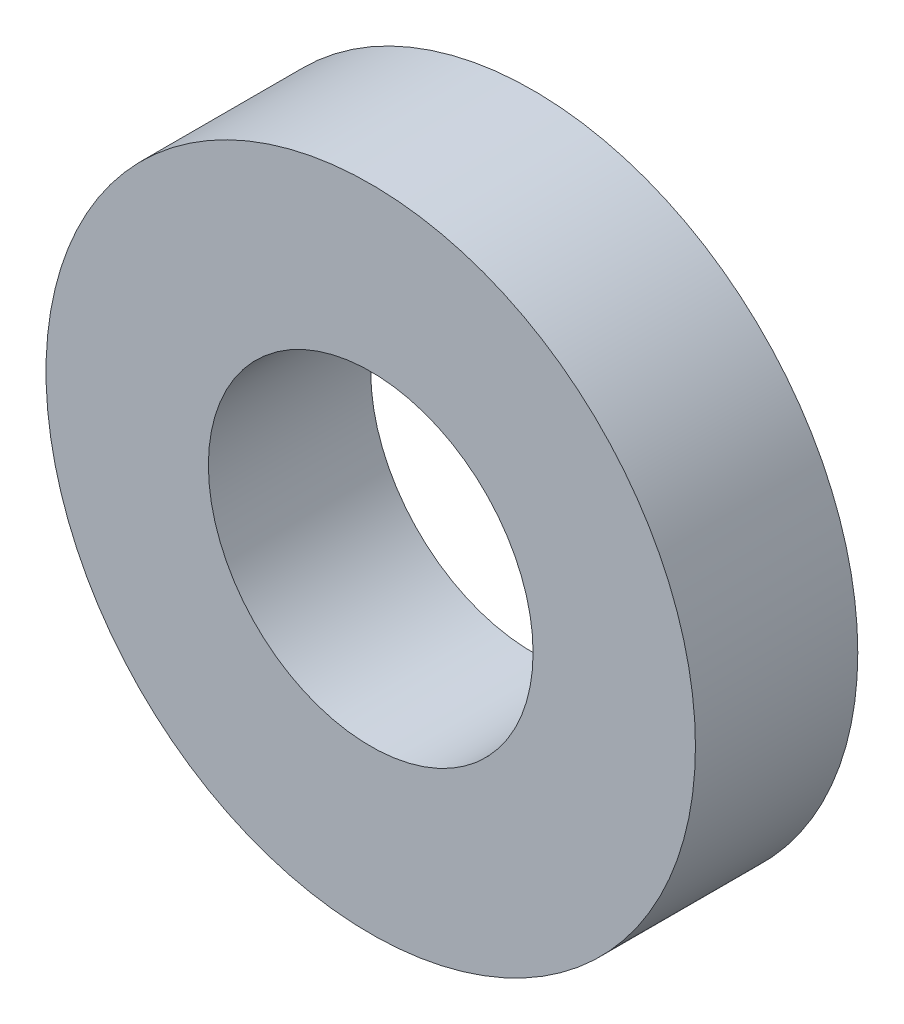
ISO-10303-21;
HEADER;
FILE_DESCRIPTION(('STEP AP214'),'2;1');
FILE_NAME('part.step','',(''),(''),'','','');
FILE_SCHEMA(('AUTOMOTIVE_DESIGN { 1 0 10303 214 1 1 1 1 }'));
ENDSEC;
DATA;
#1=APPLICATION_CONTEXT('core data for automotive mechanical design processes');
#2=APPLICATION_PROTOCOL_DEFINITION('international standard','automotive_design',2000,#1);
#3=PRODUCT_CONTEXT('',#1,'mechanical');
#4=PRODUCT('Part','Part','',(#3));
#5=PRODUCT_RELATED_PRODUCT_CATEGORY('part','',(#4));
#6=PRODUCT_DEFINITION_FORMATION('','',#4);
#7=PRODUCT_DEFINITION_CONTEXT('part definition',#1,'design');
#8=PRODUCT_DEFINITION('design','',#6,#7);
#9=PRODUCT_DEFINITION_SHAPE('','',#8);
#10=(LENGTH_UNIT() NAMED_UNIT(*) SI_UNIT(.MILLI.,.METRE.));
#11=(NAMED_UNIT(*) PLANE_ANGLE_UNIT() SI_UNIT($,.RADIAN.));
#12=(NAMED_UNIT(*) SI_UNIT($,.STERADIAN.) SOLID_ANGLE_UNIT());
#13=UNCERTAINTY_MEASURE_WITH_UNIT(LENGTH_MEASURE(1.E-05),#10,'distance_accuracy_value','');
#14=(GEOMETRIC_REPRESENTATION_CONTEXT(3) GLOBAL_UNCERTAINTY_ASSIGNED_CONTEXT((#13)) GLOBAL_UNIT_ASSIGNED_CONTEXT((#10,
#11,#12)) REPRESENTATION_CONTEXT('',''));
#15=CARTESIAN_POINT('',(0.,0.,0.));
#16=DIRECTION('',(0.,0.,1.));
#17=DIRECTION('',(1.,0.,0.));
#18=AXIS2_PLACEMENT_3D('',#15,#16,#17);
#19=CARTESIAN_POINT('',(8.,8.,4.));
#20=DIRECTION('',(0.,0.,1.));
#21=DIRECTION('',(1.,0.,0.));
#22=AXIS2_PLACEMENT_3D('',#19,#20,#21);
#23=PLANE('',#22);
#24=CARTESIAN_POINT('',(8.,8.,4.));
#25=DIRECTION('',(0.,0.,1.));
#26=DIRECTION('',(1.,0.,0.));
#27=AXIS2_PLACEMENT_3D('',#24,#25,#26);
#28=CIRCLE('',#27,8.);
#29=CARTESIAN_POINT('',(16.,8.,4.));
#30=VERTEX_POINT('',#29);
#31=EDGE_CURVE('E10',#30,#30,#28,.T.);
#32=ORIENTED_EDGE('',*,*,#31,.T.);
#33=EDGE_LOOP('',(#32));
#34=FACE_BOUND('',#33,.T.);
#35=CARTESIAN_POINT('',(8.,8.,4.));
#36=DIRECTION('',(0.,0.,1.));
#37=DIRECTION('',(1.,0.,0.));
#38=AXIS2_PLACEMENT_3D('',#35,#36,#37);
#39=CIRCLE('',#38,4.);
#40=CARTESIAN_POINT('',(12.,8.,4.));
#41=VERTEX_POINT('',#40);
#42=EDGE_CURVE('E55',#41,#41,#39,.T.);
#43=ORIENTED_EDGE('',*,*,#42,.F.);
#44=EDGE_LOOP('',(#43));
#45=FACE_BOUND('',#44,.T.);
#46=ADVANCED_FACE('F41',(#34,#45),#23,.T.);
#47=CARTESIAN_POINT('',(8.,8.,0.));
#48=DIRECTION('',(0.,0.,1.));
#49=DIRECTION('',(1.,0.,0.));
#50=AXIS2_PLACEMENT_3D('',#47,#48,#49);
#51=PLANE('',#50);
#52=CARTESIAN_POINT('',(8.,8.,0.));
#53=DIRECTION('',(0.,0.,1.));
#54=DIRECTION('',(1.,0.,0.));
#55=AXIS2_PLACEMENT_3D('',#52,#53,#54);
#56=CIRCLE('',#55,8.);
#57=CARTESIAN_POINT('',(16.,8.,0.));
#58=VERTEX_POINT('',#57);
#59=EDGE_CURVE('E44',#58,#58,#56,.T.);
#60=ORIENTED_EDGE('',*,*,#59,.F.);
#61=EDGE_LOOP('',(#60));
#62=FACE_BOUND('',#61,.T.);
#63=CARTESIAN_POINT('',(8.,8.,0.));
#64=DIRECTION('',(0.,0.,1.));
#65=DIRECTION('',(1.,0.,0.));
#66=AXIS2_PLACEMENT_3D('',#63,#64,#65);
#67=CIRCLE('',#66,4.);
#68=CARTESIAN_POINT('',(12.,8.,0.));
#69=VERTEX_POINT('',#68);
#70=EDGE_CURVE('E53',#69,#69,#67,.T.);
#71=ORIENTED_EDGE('',*,*,#70,.T.);
#72=EDGE_LOOP('',(#71));
#73=FACE_BOUND('',#72,.T.);
#74=ADVANCED_FACE('F62',(#62,#73),#51,.F.);
#75=CARTESIAN_POINT('',(8.,8.,4.));
#76=DIRECTION('',(0.,0.,-1.));
#77=DIRECTION('',(-1.,0.,0.));
#78=AXIS2_PLACEMENT_3D('',#75,#76,#77);
#79=CYLINDRICAL_SURFACE('',#78,8.);
#80=ORIENTED_EDGE('',*,*,#31,.F.);
#81=EDGE_LOOP('',(#80));
#82=FACE_BOUND('',#81,.T.);
#83=ORIENTED_EDGE('',*,*,#59,.T.);
#84=EDGE_LOOP('',(#83));
#85=FACE_BOUND('',#84,.T.);
#86=ADVANCED_FACE('F43',(#82,#85),#79,.T.);
#87=CARTESIAN_POINT('',(8.,8.,4.));
#88=DIRECTION('',(0.,0.,-1.));
#89=DIRECTION('',(-1.,0.,0.));
#90=AXIS2_PLACEMENT_3D('',#87,#88,#89);
#91=CYLINDRICAL_SURFACE('',#90,4.);
#92=ORIENTED_EDGE('',*,*,#42,.T.);
#93=EDGE_LOOP('',(#92));
#94=FACE_BOUND('',#93,.T.);
#95=ORIENTED_EDGE('',*,*,#70,.F.);
#96=EDGE_LOOP('',(#95));
#97=FACE_BOUND('',#96,.T.);
#98=ADVANCED_FACE('F58',(#94,#97),#91,.F.);
#99=CLOSED_SHELL('',(#46,#74,#86,#98));
#100=MANIFOLD_SOLID_BREP('B2',#99);
#101=ADVANCED_BREP_SHAPE_REPRESENTATION('',(#18,#100),#14);
#102=SHAPE_DEFINITION_REPRESENTATION(#9,#101);
ENDSEC;
END-ISO-10303-21;
